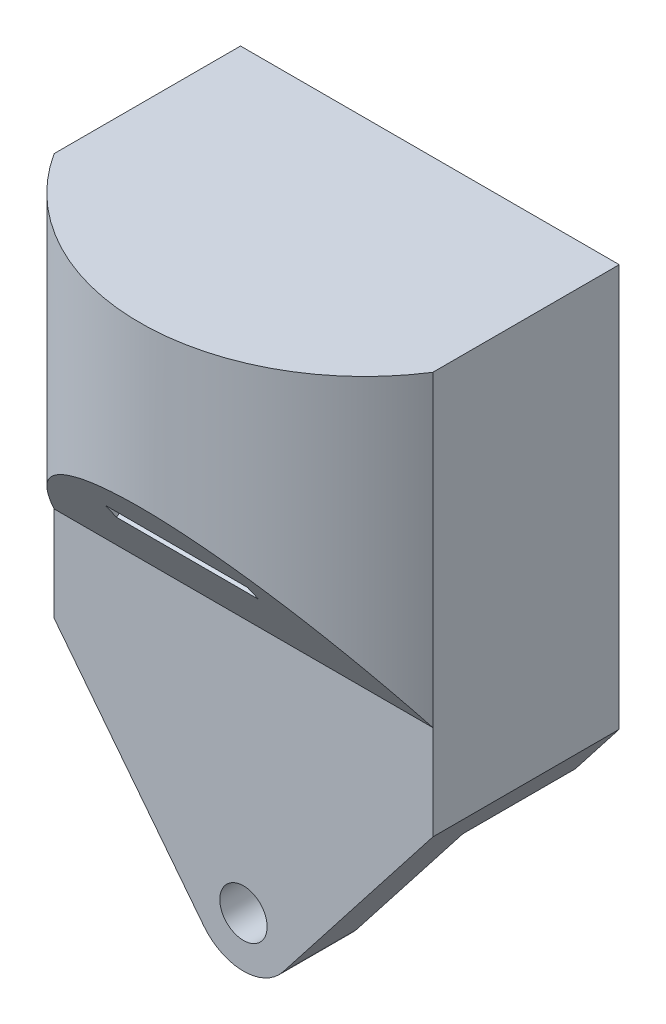
ISO-10303-21;
HEADER;
FILE_DESCRIPTION(('STEP AP214'),'2;1');
FILE_NAME('part.step','',(''),(''),'','','');
FILE_SCHEMA(('AUTOMOTIVE_DESIGN { 1 0 10303 214 1 1 1 1 }'));
ENDSEC;
DATA;
#1=APPLICATION_CONTEXT('core data for automotive mechanical design processes');
#2=APPLICATION_PROTOCOL_DEFINITION('international standard','automotive_design',2000,#1);
#3=PRODUCT_CONTEXT('',#1,'mechanical');
#4=PRODUCT('Part','Part','',(#3));
#5=PRODUCT_RELATED_PRODUCT_CATEGORY('part','',(#4));
#6=PRODUCT_DEFINITION_FORMATION('','',#4);
#7=PRODUCT_DEFINITION_CONTEXT('part definition',#1,'design');
#8=PRODUCT_DEFINITION('design','',#6,#7);
#9=PRODUCT_DEFINITION_SHAPE('','',#8);
#10=(LENGTH_UNIT() NAMED_UNIT(*) SI_UNIT(.MILLI.,.METRE.));
#11=(NAMED_UNIT(*) PLANE_ANGLE_UNIT() SI_UNIT($,.RADIAN.));
#12=(NAMED_UNIT(*) SI_UNIT($,.STERADIAN.) SOLID_ANGLE_UNIT());
#13=UNCERTAINTY_MEASURE_WITH_UNIT(LENGTH_MEASURE(1.E-05),#10,'distance_accuracy_value','');
#14=(GEOMETRIC_REPRESENTATION_CONTEXT(3) GLOBAL_UNCERTAINTY_ASSIGNED_CONTEXT((#13)) GLOBAL_UNIT_ASSIGNED_CONTEXT((#10,
#11,#12)) REPRESENTATION_CONTEXT('',''));
#15=CARTESIAN_POINT('',(0.,0.,0.));
#16=DIRECTION('',(0.,0.,1.));
#17=DIRECTION('',(1.,0.,0.));
#18=AXIS2_PLACEMENT_3D('',#15,#16,#17);
#19=CARTESIAN_POINT('',(64.,-54.3036872871511,0.));
#20=DIRECTION('',(0.,0.,1.));
#21=DIRECTION('',(1.,0.,0.));
#22=AXIS2_PLACEMENT_3D('',#19,#20,#21);
#23=PLANE('',#22);
#24=CARTESIAN_POINT('',(64.,-54.3036872871511,0.));
#25=DIRECTION('',(0.,0.,1.));
#26=DIRECTION('',(1.,0.,0.));
#27=AXIS2_PLACEMENT_3D('',#24,#25,#26);
#28=CIRCLE('',#27,8.00000000000001);
#29=CARTESIAN_POINT('',(72.,-54.3036872871511,0.));
#30=VERTEX_POINT('',#29);
#31=EDGE_CURVE('E175',#30,#30,#28,.T.);
#32=ORIENTED_EDGE('',*,*,#31,.T.);
#33=EDGE_LOOP('',(#32));
#34=FACE_BOUND('',#33,.T.);
#35=DIRECTION('',(-1.,0.,0.));
#36=VECTOR('',#35,1.);
#37=CARTESIAN_POINT('',(14.8444269036275,-19.,0.));
#38=LINE('',#37,#36);
#39=CARTESIAN_POINT('',(113.155573096373,-19.,0.));
#40=VERTEX_POINT('',#39);
#41=CARTESIAN_POINT('',(14.8444269036275,-19.,0.));
#42=VERTEX_POINT('',#41);
#43=EDGE_CURVE('E54',#40,#42,#38,.T.);
#44=ORIENTED_EDGE('',*,*,#43,.F.);
#45=DIRECTION('',(0.615661475325655,0.788010753606725,0.));
#46=VECTOR('',#45,1.);
#47=CARTESIAN_POINT('',(128.,0.,0.));
#48=LINE('',#47,#46);
#49=CARTESIAN_POINT('',(77.3961828113143,-64.7699323676872,0.));
#50=VERTEX_POINT('',#49);
#51=EDGE_CURVE('E179',#50,#40,#48,.T.);
#52=ORIENTED_EDGE('',*,*,#51,.F.);
#53=CARTESIAN_POINT('',(64.,-54.3036872871511,0.));
#54=DIRECTION('',(0.,0.,1.));
#55=DIRECTION('',(1.,0.,0.));
#56=AXIS2_PLACEMENT_3D('',#53,#54,#55);
#57=CIRCLE('',#56,17.);
#58=CARTESIAN_POINT('',(50.6038171886856,-64.7699323676872,0.));
#59=VERTEX_POINT('',#58);
#60=EDGE_CURVE('E249',#59,#50,#57,.T.);
#61=ORIENTED_EDGE('',*,*,#60,.F.);
#62=DIRECTION('',(0.615661475325654,-0.788010753606725,0.));
#63=VECTOR('',#62,1.);
#64=CARTESIAN_POINT('',(0.,0.,0.));
#65=LINE('',#64,#63);
#66=EDGE_CURVE('E233',#42,#59,#65,.T.);
#67=ORIENTED_EDGE('',*,*,#66,.F.);
#68=EDGE_LOOP('',(#44,#52,#61,#67));
#69=FACE_BOUND('',#68,.T.);
#70=ADVANCED_FACE('F37',(#34,#69),#23,.F.);
#71=CARTESIAN_POINT('',(64.,-54.3036872871511,25.));
#72=DIRECTION('',(0.,0.,1.));
#73=DIRECTION('',(1.,0.,0.));
#74=AXIS2_PLACEMENT_3D('',#71,#72,#73);
#75=PLANE('',#74);
#76=CARTESIAN_POINT('',(64.,-54.3036872871511,25.));
#77=DIRECTION('',(0.,0.,1.));
#78=DIRECTION('',(1.,0.,0.));
#79=AXIS2_PLACEMENT_3D('',#76,#77,#78);
#80=CIRCLE('',#79,8.00000000000001);
#81=CARTESIAN_POINT('',(72.,-54.3036872871511,25.));
#82=VERTEX_POINT('',#81);
#83=EDGE_CURVE('E185',#82,#82,#80,.T.);
#84=ORIENTED_EDGE('',*,*,#83,.F.);
#85=EDGE_LOOP('',(#84));
#86=FACE_BOUND('',#85,.T.);
#87=DIRECTION('',(0.,1.,0.));
#88=VECTOR('',#87,1.);
#89=CARTESIAN_POINT('',(128.,136.,25.));
#90=LINE('',#89,#88);
#91=CARTESIAN_POINT('',(128.,0.,25.));
#92=VERTEX_POINT('',#91);
#93=CARTESIAN_POINT('',(128.,32.,25.));
#94=VERTEX_POINT('',#93);
#95=EDGE_CURVE('E143',#92,#94,#90,.T.);
#96=ORIENTED_EDGE('',*,*,#95,.T.);
#97=DIRECTION('',(1.,0.,0.));
#98=VECTOR('',#97,1.);
#99=CARTESIAN_POINT('',(0.,32.,25.));
#100=LINE('',#99,#98);
#101=CARTESIAN_POINT('',(0.,32.,25.));
#102=VERTEX_POINT('',#101);
#103=EDGE_CURVE('E225',#102,#94,#100,.T.);
#104=ORIENTED_EDGE('',*,*,#103,.F.);
#105=DIRECTION('',(0.,-1.,0.));
#106=VECTOR('',#105,1.);
#107=CARTESIAN_POINT('',(0.,0.,25.));
#108=LINE('',#107,#106);
#109=CARTESIAN_POINT('',(0.,0.,25.));
#110=VERTEX_POINT('',#109);
#111=EDGE_CURVE('E242',#102,#110,#108,.T.);
#112=ORIENTED_EDGE('',*,*,#111,.T.);
#113=DIRECTION('',(0.615661475325654,-0.788010753606725,0.));
#114=VECTOR('',#113,1.);
#115=CARTESIAN_POINT('',(0.,0.,25.));
#116=LINE('',#115,#114);
#117=CARTESIAN_POINT('',(50.6038171886856,-64.7699323676872,25.));
#118=VERTEX_POINT('',#117);
#119=EDGE_CURVE('E234',#110,#118,#116,.T.);
#120=ORIENTED_EDGE('',*,*,#119,.T.);
#121=CARTESIAN_POINT('',(64.,-54.3036872871511,25.));
#122=DIRECTION('',(0.,0.,1.));
#123=DIRECTION('',(1.,0.,0.));
#124=AXIS2_PLACEMENT_3D('',#121,#122,#123);
#125=CIRCLE('',#124,17.);
#126=CARTESIAN_POINT('',(77.3961828113143,-64.7699323676872,25.));
#127=VERTEX_POINT('',#126);
#128=EDGE_CURVE('E237',#118,#127,#125,.T.);
#129=ORIENTED_EDGE('',*,*,#128,.T.);
#130=DIRECTION('',(0.615661475325655,0.788010753606725,0.));
#131=VECTOR('',#130,1.);
#132=CARTESIAN_POINT('',(128.,0.,25.));
#133=LINE('',#132,#131);
#134=EDGE_CURVE('E239',#127,#92,#133,.T.);
#135=ORIENTED_EDGE('',*,*,#134,.T.);
#136=EDGE_LOOP('',(#96,#104,#112,#120,#129,#135));
#137=FACE_BOUND('',#136,.T.);
#138=ADVANCED_FACE('F275',(#86,#137),#75,.T.);
#139=CARTESIAN_POINT('',(0.,0.,25.));
#140=DIRECTION('',(0.788010753606725,0.615661475325654,0.));
#141=DIRECTION('',(-0.615661475325654,0.788010753606725,0.));
#142=AXIS2_PLACEMENT_3D('',#139,#140,#141);
#143=PLANE('',#142);
#144=DIRECTION('',(0.,0.,-1.));
#145=VECTOR('',#144,1.);
#146=CARTESIAN_POINT('',(0.,0.,25.));
#147=LINE('',#146,#145);
#148=CARTESIAN_POINT('',(0.,0.,-38.));
#149=VERTEX_POINT('',#148);
#150=EDGE_CURVE('E246',#110,#149,#147,.T.);
#151=ORIENTED_EDGE('',*,*,#150,.T.);
#152=DIRECTION('',(-0.615661475325654,0.788010753606725,0.));
#153=VECTOR('',#152,1.);
#154=CARTESIAN_POINT('',(0.,0.,-38.));
#155=LINE('',#154,#153);
#156=CARTESIAN_POINT('',(14.8444269036275,-19.,-38.));
#157=VERTEX_POINT('',#156);
#158=EDGE_CURVE('E166',#157,#149,#155,.T.);
#159=ORIENTED_EDGE('',*,*,#158,.F.);
#160=DIRECTION('',(0.,0.,1.));
#161=VECTOR('',#160,1.);
#162=CARTESIAN_POINT('',(14.8444269036275,-19.,-38.));
#163=LINE('',#162,#161);
#164=EDGE_CURVE('E172',#157,#42,#163,.T.);
#165=ORIENTED_EDGE('',*,*,#164,.T.);
#166=ORIENTED_EDGE('',*,*,#66,.T.);
#167=DIRECTION('',(0.,0.,-1.));
#168=VECTOR('',#167,1.);
#169=CARTESIAN_POINT('',(50.6038171886856,-64.7699323676872,25.));
#170=LINE('',#169,#168);
#171=EDGE_CURVE('E11',#118,#59,#170,.T.);
#172=ORIENTED_EDGE('',*,*,#171,.F.);
#173=ORIENTED_EDGE('',*,*,#119,.F.);
#174=EDGE_LOOP('',(#151,#159,#165,#166,#172,#173));
#175=FACE_BOUND('',#174,.T.);
#176=ADVANCED_FACE('F39',(#175),#143,.F.);
#177=CARTESIAN_POINT('',(64.,-54.3036872871511,25.));
#178=DIRECTION('',(0.,0.,-1.));
#179=DIRECTION('',(-1.,0.,0.));
#180=AXIS2_PLACEMENT_3D('',#177,#178,#179);
#181=CYLINDRICAL_SURFACE('',#180,17.);
#182=ORIENTED_EDGE('',*,*,#60,.T.);
#183=DIRECTION('',(0.,0.,-1.));
#184=VECTOR('',#183,1.);
#185=CARTESIAN_POINT('',(77.3961828113143,-64.7699323676872,25.));
#186=LINE('',#185,#184);
#187=EDGE_CURVE('E46',#127,#50,#186,.T.);
#188=ORIENTED_EDGE('',*,*,#187,.F.);
#189=ORIENTED_EDGE('',*,*,#128,.F.);
#190=ORIENTED_EDGE('',*,*,#171,.T.);
#191=EDGE_LOOP('',(#182,#188,#189,#190));
#192=FACE_BOUND('',#191,.T.);
#193=ADVANCED_FACE('F279',(#192),#181,.T.);
#194=CARTESIAN_POINT('',(128.,0.,25.));
#195=DIRECTION('',(-0.788010753606725,0.615661475325655,0.));
#196=DIRECTION('',(-0.615661475325655,-0.788010753606725,0.));
#197=AXIS2_PLACEMENT_3D('',#194,#195,#196);
#198=PLANE('',#197);
#199=ORIENTED_EDGE('',*,*,#51,.T.);
#200=DIRECTION('',(0.,0.,1.));
#201=VECTOR('',#200,1.);
#202=CARTESIAN_POINT('',(113.155573096373,-19.,-38.));
#203=LINE('',#202,#201);
#204=CARTESIAN_POINT('',(113.155573096373,-19.,-38.));
#205=VERTEX_POINT('',#204);
#206=EDGE_CURVE('E152',#205,#40,#203,.T.);
#207=ORIENTED_EDGE('',*,*,#206,.F.);
#208=DIRECTION('',(-0.615661475325655,-0.788010753606725,0.));
#209=VECTOR('',#208,1.);
#210=CARTESIAN_POINT('',(113.155573096373,-19.,-38.));
#211=LINE('',#210,#209);
#212=CARTESIAN_POINT('',(128.,0.,-38.));
#213=VERTEX_POINT('',#212);
#214=EDGE_CURVE('E149',#213,#205,#211,.T.);
#215=ORIENTED_EDGE('',*,*,#214,.F.);
#216=DIRECTION('',(0.,0.,-1.));
#217=VECTOR('',#216,1.);
#218=CARTESIAN_POINT('',(128.,0.,25.));
#219=LINE('',#218,#217);
#220=EDGE_CURVE('E136',#92,#213,#219,.T.);
#221=ORIENTED_EDGE('',*,*,#220,.F.);
#222=ORIENTED_EDGE('',*,*,#134,.F.);
#223=ORIENTED_EDGE('',*,*,#187,.T.);
#224=EDGE_LOOP('',(#199,#207,#215,#221,#222,#223));
#225=FACE_BOUND('',#224,.T.);
#226=ADVANCED_FACE('F150',(#225),#198,.F.);
#227=CARTESIAN_POINT('',(128.,136.,25.));
#228=DIRECTION('',(-1.,0.,0.));
#229=DIRECTION('',(0.,-1.,0.));
#230=AXIS2_PLACEMENT_3D('',#227,#228,#229);
#231=PLANE('',#230);
#232=ORIENTED_EDGE('',*,*,#220,.T.);
#233=DIRECTION('',(0.,-1.,0.));
#234=VECTOR('',#233,1.);
#235=CARTESIAN_POINT('',(128.,0.,-38.));
#236=LINE('',#235,#234);
#237=CARTESIAN_POINT('',(128.,136.,-38.));
#238=VERTEX_POINT('',#237);
#239=EDGE_CURVE('E140',#238,#213,#236,.T.);
#240=ORIENTED_EDGE('',*,*,#239,.F.);
#241=DIRECTION('',(0.,0.,-1.));
#242=VECTOR('',#241,1.);
#243=CARTESIAN_POINT('',(128.,136.,25.));
#244=LINE('',#243,#242);
#245=CARTESIAN_POINT('',(128.,136.,25.));
#246=VERTEX_POINT('',#245);
#247=EDGE_CURVE('E146',#246,#238,#244,.T.);
#248=ORIENTED_EDGE('',*,*,#247,.F.);
#249=DIRECTION('',(0.,1.,0.));
#250=VECTOR('',#249,1.);
#251=CARTESIAN_POINT('',(128.,32.,25.));
#252=LINE('',#251,#250);
#253=EDGE_CURVE('E228',#94,#246,#252,.T.);
#254=ORIENTED_EDGE('',*,*,#253,.F.);
#255=ORIENTED_EDGE('',*,*,#95,.F.);
#256=EDGE_LOOP('',(#232,#240,#248,#254,#255));
#257=FACE_BOUND('',#256,.T.);
#258=ADVANCED_FACE('F138',(#257),#231,.F.);
#259=CARTESIAN_POINT('',(0.,136.,25.));
#260=DIRECTION('',(0.,-1.,0.));
#261=DIRECTION('',(0.,0.,-1.));
#262=AXIS2_PLACEMENT_3D('',#259,#260,#261);
#263=PLANE('',#262);
#264=ORIENTED_EDGE('',*,*,#247,.T.);
#265=DIRECTION('',(1.,0.,0.));
#266=VECTOR('',#265,1.);
#267=CARTESIAN_POINT('',(128.,136.,-38.));
#268=LINE('',#267,#266);
#269=CARTESIAN_POINT('',(0.,136.,-38.));
#270=VERTEX_POINT('',#269);
#271=EDGE_CURVE('E161',#270,#238,#268,.T.);
#272=ORIENTED_EDGE('',*,*,#271,.F.);
#273=DIRECTION('',(0.,0.,-1.));
#274=VECTOR('',#273,1.);
#275=CARTESIAN_POINT('',(0.,136.,25.));
#276=LINE('',#275,#274);
#277=CARTESIAN_POINT('',(0.,136.,25.));
#278=VERTEX_POINT('',#277);
#279=EDGE_CURVE('E254',#278,#270,#276,.T.);
#280=ORIENTED_EDGE('',*,*,#279,.F.);
#281=CARTESIAN_POINT('',(64.,136.,-16.0142857142857));
#282=DIRECTION('',(0.,1.,0.));
#283=DIRECTION('',(0.,0.,1.));
#284=AXIS2_PLACEMENT_3D('',#281,#282,#283);
#285=CIRCLE('',#284,76.0142857142857);
#286=EDGE_CURVE('E224',#278,#246,#285,.T.);
#287=ORIENTED_EDGE('',*,*,#286,.T.);
#288=EDGE_LOOP('',(#264,#272,#280,#287));
#289=FACE_BOUND('',#288,.T.);
#290=ADVANCED_FACE('F270',(#289),#263,.F.);
#291=CARTESIAN_POINT('',(0.,0.,25.));
#292=DIRECTION('',(1.,0.,0.));
#293=DIRECTION('',(0.,0.,-1.));
#294=AXIS2_PLACEMENT_3D('',#291,#292,#293);
#295=PLANE('',#294);
#296=ORIENTED_EDGE('',*,*,#279,.T.);
#297=DIRECTION('',(0.,1.,0.));
#298=VECTOR('',#297,1.);
#299=CARTESIAN_POINT('',(0.,136.,-38.));
#300=LINE('',#299,#298);
#301=EDGE_CURVE('E169',#149,#270,#300,.T.);
#302=ORIENTED_EDGE('',*,*,#301,.F.);
#303=ORIENTED_EDGE('',*,*,#150,.F.);
#304=ORIENTED_EDGE('',*,*,#111,.F.);
#305=EDGE_CURVE('E243',#278,#102,#108,.T.);
#306=ORIENTED_EDGE('',*,*,#305,.F.);
#307=EDGE_LOOP('',(#296,#302,#303,#304,#306));
#308=FACE_BOUND('',#307,.T.);
#309=ADVANCED_FACE('F266',(#308),#295,.F.);
#310=CARTESIAN_POINT('',(64.,32.,-16.0142857142857));
#311=DIRECTION('',(0.,1.,0.));
#312=DIRECTION('',(0.,0.,1.));
#313=AXIS2_PLACEMENT_3D('',#310,#311,#312);
#314=CYLINDRICAL_SURFACE('',#313,76.0142857142857);
#315=CARTESIAN_POINT('',(64.,-26.5918367346938,-16.0142857142857));
#316=DIRECTION('',(0.,0.573462344363329,-0.81923192051904));
#317=DIRECTION('',(0.,0.81923192051904,0.573462344363329));
#318=AXIS2_PLACEMENT_3D('',#315,#316,#317);
#319=ELLIPSE('',#318,132.553229451671,76.0142857142857);
#320=EDGE_CURVE('E217',#94,#102,#319,.F.);
#321=ORIENTED_EDGE('',*,*,#320,.F.);
#322=ORIENTED_EDGE('',*,*,#253,.T.);
#323=ORIENTED_EDGE('',*,*,#286,.F.);
#324=ORIENTED_EDGE('',*,*,#305,.T.);
#325=EDGE_LOOP('',(#321,#322,#323,#324));
#326=FACE_BOUND('',#325,.T.);
#327=ADVANCED_FACE('F272',(#326),#314,.T.);
#328=CARTESIAN_POINT('',(0.,82.,60.));
#329=DIRECTION('',(0.,0.573462344363329,-0.81923192051904));
#330=DIRECTION('',(0.,0.81923192051904,0.573462344363329));
#331=AXIS2_PLACEMENT_3D('',#328,#329,#330);
#332=PLANE('',#331);
#333=DIRECTION('',(1.,0.,0.));
#334=VECTOR('',#333,1.);
#335=CARTESIAN_POINT('',(40.,59.0346533771283,43.9242573639899));
#336=LINE('',#335,#334);
#337=CARTESIAN_POINT('',(40.,59.0346533771283,43.9242573639899));
#338=VERTEX_POINT('',#337);
#339=CARTESIAN_POINT('',(88.,59.0346533771283,43.9242573639899));
#340=VERTEX_POINT('',#339);
#341=EDGE_CURVE('E207',#338,#340,#336,.T.);
#342=ORIENTED_EDGE('',*,*,#341,.F.);
#343=DIRECTION('',(0.,-0.819231920519041,-0.573462344363328));
#344=VECTOR('',#343,1.);
#345=CARTESIAN_POINT('',(40.,64.3596608605021,47.6517626023515));
#346=LINE('',#345,#344);
#347=CARTESIAN_POINT('',(40.,64.3596608605021,47.6517626023515));
#348=VERTEX_POINT('',#347);
#349=EDGE_CURVE('E62',#348,#338,#346,.T.);
#350=ORIENTED_EDGE('',*,*,#349,.F.);
#351=DIRECTION('',(-1.,0.,0.));
#352=VECTOR('',#351,1.);
#353=CARTESIAN_POINT('',(40.,64.3596608605021,47.6517626023515));
#354=LINE('',#353,#352);
#355=CARTESIAN_POINT('',(88.,64.3596608605021,47.6517626023515));
#356=VERTEX_POINT('',#355);
#357=EDGE_CURVE('E196',#356,#348,#354,.T.);
#358=ORIENTED_EDGE('',*,*,#357,.F.);
#359=DIRECTION('',(0.,0.81923192051904,0.573462344363328));
#360=VECTOR('',#359,1.);
#361=CARTESIAN_POINT('',(88.,64.3596608605021,47.6517626023515));
#362=LINE('',#361,#360);
#363=EDGE_CURVE('E210',#340,#356,#362,.T.);
#364=ORIENTED_EDGE('',*,*,#363,.F.);
#365=EDGE_LOOP('',(#342,#350,#358,#364));
#366=FACE_BOUND('',#365,.T.);
#367=ORIENTED_EDGE('',*,*,#320,.T.);
#368=ORIENTED_EDGE('',*,*,#103,.T.);
#369=EDGE_LOOP('',(#367,#368));
#370=FACE_BOUND('',#369,.T.);
#371=ADVANCED_FACE('F394',(#366,#370),#332,.F.);
#372=CARTESIAN_POINT('',(40.,66.0800478935921,45.1940668407944));
#373=DIRECTION('',(-1.,0.,0.));
#374=DIRECTION('',(0.,-1.,0.));
#375=AXIS2_PLACEMENT_3D('',#372,#373,#374);
#376=PLANE('',#375);
#377=ORIENTED_EDGE('',*,*,#349,.T.);
#378=DIRECTION('',(0.,-0.573462344363329,0.81923192051904));
#379=VECTOR('',#378,1.);
#380=CARTESIAN_POINT('',(40.,60.7550404102183,41.4665616024327));
#381=LINE('',#380,#379);
#382=CARTESIAN_POINT('',(40.,60.7550404102183,41.4665616024327));
#383=VERTEX_POINT('',#382);
#384=EDGE_CURVE('E205',#383,#338,#381,.T.);
#385=ORIENTED_EDGE('',*,*,#384,.F.);
#386=DIRECTION('',(0.,-0.819231920519041,-0.573462344363328));
#387=VECTOR('',#386,1.);
#388=CARTESIAN_POINT('',(40.,66.0800478935921,45.1940668407944));
#389=LINE('',#388,#387);
#390=CARTESIAN_POINT('',(40.,66.0800478935921,45.1940668407944));
#391=VERTEX_POINT('',#390);
#392=EDGE_CURVE('E192',#391,#383,#389,.T.);
#393=ORIENTED_EDGE('',*,*,#392,.F.);
#394=DIRECTION('',(0.,-0.573462344363329,0.81923192051904));
#395=VECTOR('',#394,1.);
#396=CARTESIAN_POINT('',(40.,66.0800478935921,45.1940668407944));
#397=LINE('',#396,#395);
#398=EDGE_CURVE('E215',#391,#348,#397,.T.);
#399=ORIENTED_EDGE('',*,*,#398,.T.);
#400=EDGE_LOOP('',(#377,#385,#393,#399));
#401=FACE_BOUND('',#400,.T.);
#402=ADVANCED_FACE('F399',(#401),#376,.F.);
#403=CARTESIAN_POINT('',(40.,66.0800478935921,45.1940668407944));
#404=DIRECTION('',(0.,0.81923192051904,0.573462344363329));
#405=DIRECTION('',(0.,-0.573462344363329,0.81923192051904));
#406=AXIS2_PLACEMENT_3D('',#403,#404,#405);
#407=PLANE('',#406);
#408=ORIENTED_EDGE('',*,*,#357,.T.);
#409=ORIENTED_EDGE('',*,*,#398,.F.);
#410=DIRECTION('',(-1.,0.,0.));
#411=VECTOR('',#410,1.);
#412=CARTESIAN_POINT('',(40.,66.0800478935921,45.1940668407944));
#413=LINE('',#412,#411);
#414=CARTESIAN_POINT('',(88.,66.0800478935921,45.1940668407944));
#415=VERTEX_POINT('',#414);
#416=EDGE_CURVE('E202',#415,#391,#413,.T.);
#417=ORIENTED_EDGE('',*,*,#416,.F.);
#418=DIRECTION('',(0.,-0.573462344363329,0.81923192051904));
#419=VECTOR('',#418,1.);
#420=CARTESIAN_POINT('',(88.,66.0800478935921,45.1940668407944));
#421=LINE('',#420,#419);
#422=EDGE_CURVE('E218',#415,#356,#421,.T.);
#423=ORIENTED_EDGE('',*,*,#422,.T.);
#424=EDGE_LOOP('',(#408,#409,#417,#423));
#425=FACE_BOUND('',#424,.T.);
#426=ADVANCED_FACE('F407',(#425),#407,.F.);
#427=CARTESIAN_POINT('',(88.,66.0800478935921,45.1940668407944));
#428=DIRECTION('',(1.,0.,0.));
#429=DIRECTION('',(0.,1.,0.));
#430=AXIS2_PLACEMENT_3D('',#427,#428,#429);
#431=PLANE('',#430);
#432=ORIENTED_EDGE('',*,*,#363,.T.);
#433=ORIENTED_EDGE('',*,*,#422,.F.);
#434=DIRECTION('',(0.,0.81923192051904,0.573462344363328));
#435=VECTOR('',#434,1.);
#436=CARTESIAN_POINT('',(88.,66.0800478935921,45.1940668407944));
#437=LINE('',#436,#435);
#438=CARTESIAN_POINT('',(88.,60.7550404102183,41.4665616024327));
#439=VERTEX_POINT('',#438);
#440=EDGE_CURVE('E199',#439,#415,#437,.T.);
#441=ORIENTED_EDGE('',*,*,#440,.F.);
#442=DIRECTION('',(0.,-0.573462344363329,0.81923192051904));
#443=VECTOR('',#442,1.);
#444=CARTESIAN_POINT('',(88.,60.7550404102183,41.4665616024327));
#445=LINE('',#444,#443);
#446=EDGE_CURVE('E220',#439,#340,#445,.T.);
#447=ORIENTED_EDGE('',*,*,#446,.T.);
#448=EDGE_LOOP('',(#432,#433,#441,#447));
#449=FACE_BOUND('',#448,.T.);
#450=ADVANCED_FACE('F414',(#449),#431,.F.);
#451=CARTESIAN_POINT('',(40.,60.7550404102183,41.4665616024327));
#452=DIRECTION('',(0.,-0.81923192051904,-0.573462344363329));
#453=DIRECTION('',(0.,0.573462344363329,-0.81923192051904));
#454=AXIS2_PLACEMENT_3D('',#451,#452,#453);
#455=PLANE('',#454);
#456=ORIENTED_EDGE('',*,*,#341,.T.);
#457=ORIENTED_EDGE('',*,*,#446,.F.);
#458=DIRECTION('',(1.,0.,0.));
#459=VECTOR('',#458,1.);
#460=CARTESIAN_POINT('',(40.,60.7550404102183,41.4665616024327));
#461=LINE('',#460,#459);
#462=EDGE_CURVE('E195',#383,#439,#461,.T.);
#463=ORIENTED_EDGE('',*,*,#462,.F.);
#464=ORIENTED_EDGE('',*,*,#384,.T.);
#465=EDGE_LOOP('',(#456,#457,#463,#464));
#466=FACE_BOUND('',#465,.T.);
#467=ADVANCED_FACE('F422',(#466),#455,.F.);
#468=CARTESIAN_POINT('',(0.,0.498910523022829,-0.712729318604037));
#469=DIRECTION('',(0.,-0.573462344363328,0.819231920519041));
#470=DIRECTION('',(0.,-0.819231920519041,-0.573462344363328));
#471=AXIS2_PLACEMENT_3D('',#468,#469,#470);
#472=PLANE('',#471);
#473=ORIENTED_EDGE('',*,*,#392,.T.);
#474=ORIENTED_EDGE('',*,*,#462,.T.);
#475=ORIENTED_EDGE('',*,*,#440,.T.);
#476=ORIENTED_EDGE('',*,*,#416,.T.);
#477=EDGE_LOOP('',(#473,#474,#475,#476));
#478=FACE_BOUND('',#477,.T.);
#479=ADVANCED_FACE('F289',(#478),#472,.T.);
#480=CARTESIAN_POINT('',(64.,-54.3036872871511,0.));
#481=DIRECTION('',(0.,0.,1.));
#482=DIRECTION('',(1.,0.,0.));
#483=AXIS2_PLACEMENT_3D('',#480,#481,#482);
#484=CYLINDRICAL_SURFACE('',#483,8.00000000000001);
#485=ORIENTED_EDGE('',*,*,#31,.F.);
#486=EDGE_LOOP('',(#485));
#487=FACE_BOUND('',#486,.T.);
#488=ORIENTED_EDGE('',*,*,#83,.T.);
#489=EDGE_LOOP('',(#488));
#490=FACE_BOUND('',#489,.T.);
#491=ADVANCED_FACE('F282',(#487,#490),#484,.F.);
#492=CARTESIAN_POINT('',(14.8444269036275,-19.,-38.));
#493=DIRECTION('',(0.,1.,0.));
#494=DIRECTION('',(-1.,0.,0.));
#495=AXIS2_PLACEMENT_3D('',#492,#493,#494);
#496=PLANE('',#495);
#497=ORIENTED_EDGE('',*,*,#43,.T.);
#498=ORIENTED_EDGE('',*,*,#164,.F.);
#499=DIRECTION('',(-1.,0.,0.));
#500=VECTOR('',#499,1.);
#501=CARTESIAN_POINT('',(14.8444269036275,-19.,-38.));
#502=LINE('',#501,#500);
#503=EDGE_CURVE('E155',#205,#157,#502,.T.);
#504=ORIENTED_EDGE('',*,*,#503,.F.);
#505=ORIENTED_EDGE('',*,*,#206,.T.);
#506=EDGE_LOOP('',(#497,#498,#504,#505));
#507=FACE_BOUND('',#506,.T.);
#508=ADVANCED_FACE('F280',(#507),#496,.F.);
#509=CARTESIAN_POINT('',(0.,0.,-38.));
#510=DIRECTION('',(0.,0.,1.));
#511=DIRECTION('',(1.,0.,0.));
#512=AXIS2_PLACEMENT_3D('',#509,#510,#511);
#513=PLANE('',#512);
#514=ORIENTED_EDGE('',*,*,#239,.T.);
#515=ORIENTED_EDGE('',*,*,#214,.T.);
#516=ORIENTED_EDGE('',*,*,#503,.T.);
#517=ORIENTED_EDGE('',*,*,#158,.T.);
#518=ORIENTED_EDGE('',*,*,#301,.T.);
#519=ORIENTED_EDGE('',*,*,#271,.T.);
#520=EDGE_LOOP('',(#514,#515,#516,#517,#518,#519));
#521=FACE_BOUND('',#520,.T.);
#522=ADVANCED_FACE('F158',(#521),#513,.F.);
#523=CLOSED_SHELL('',(#70,#138,#176,#193,#226,#258,#290,#309,#327,#371,#402,#426,#450,#467,#479,
#491,#508,#522));
#524=MANIFOLD_SOLID_BREP('B2',#523);
#525=ADVANCED_BREP_SHAPE_REPRESENTATION('',(#18,#524),#14);
#526=SHAPE_DEFINITION_REPRESENTATION(#9,#525);
ENDSEC;
END-ISO-10303-21;
